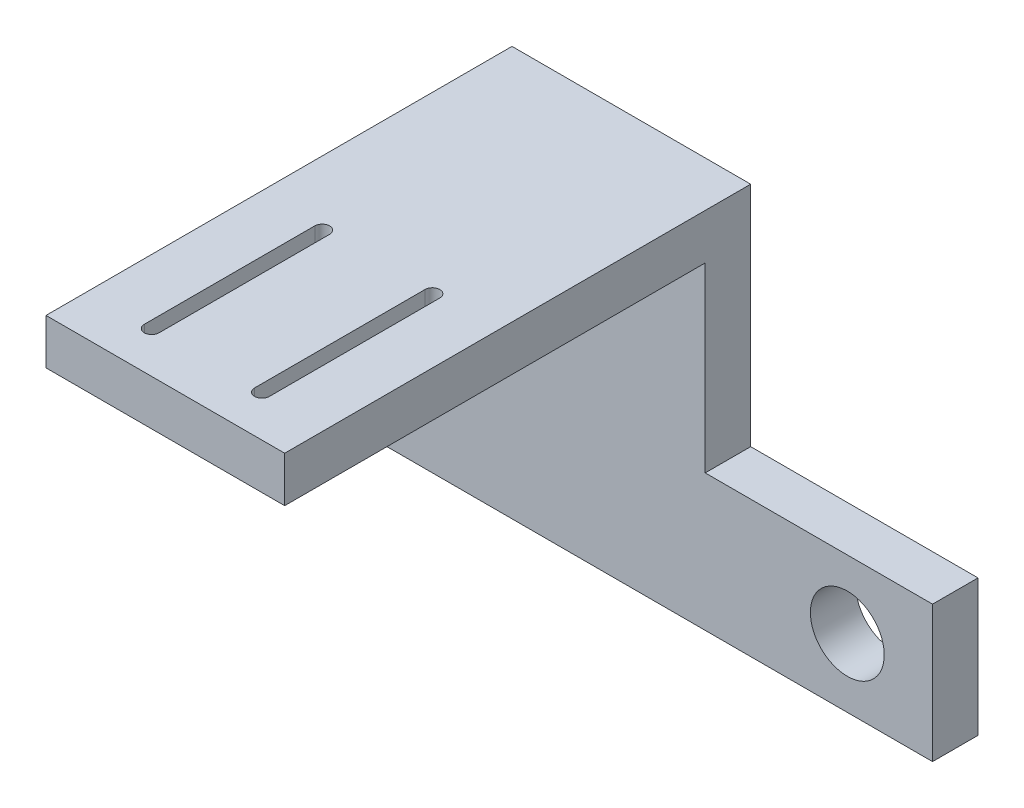
ISO-10303-21;
HEADER;
FILE_DESCRIPTION(('STEP AP214'),'2;1');
FILE_NAME('part.step','',(''),(''),'','','');
FILE_SCHEMA(('AUTOMOTIVE_DESIGN { 1 0 10303 214 1 1 1 1 }'));
ENDSEC;
DATA;
#1=APPLICATION_CONTEXT('core data for automotive mechanical design processes');
#2=APPLICATION_PROTOCOL_DEFINITION('international standard','automotive_design',2000,#1);
#3=PRODUCT_CONTEXT('',#1,'mechanical');
#4=PRODUCT('Part','Part','',(#3));
#5=PRODUCT_RELATED_PRODUCT_CATEGORY('part','',(#4));
#6=PRODUCT_DEFINITION_FORMATION('','',#4);
#7=PRODUCT_DEFINITION_CONTEXT('part definition',#1,'design');
#8=PRODUCT_DEFINITION('design','',#6,#7);
#9=PRODUCT_DEFINITION_SHAPE('','',#8);
#10=(LENGTH_UNIT() NAMED_UNIT(*) SI_UNIT(.MILLI.,.METRE.));
#11=(NAMED_UNIT(*) PLANE_ANGLE_UNIT() SI_UNIT($,.RADIAN.));
#12=(NAMED_UNIT(*) SI_UNIT($,.STERADIAN.) SOLID_ANGLE_UNIT());
#13=UNCERTAINTY_MEASURE_WITH_UNIT(LENGTH_MEASURE(1.E-05),#10,'distance_accuracy_value','');
#14=(GEOMETRIC_REPRESENTATION_CONTEXT(3) GLOBAL_UNCERTAINTY_ASSIGNED_CONTEXT((#13)) GLOBAL_UNIT_ASSIGNED_CONTEXT((#10,
#11,#12)) REPRESENTATION_CONTEXT('',''));
#15=CARTESIAN_POINT('',(0.,0.,0.));
#16=DIRECTION('',(0.,0.,1.));
#17=DIRECTION('',(1.,0.,0.));
#18=AXIS2_PLACEMENT_3D('',#15,#16,#17);
#19=CARTESIAN_POINT('',(0.,12.,4.));
#20=DIRECTION('',(0.,-1.,0.));
#21=DIRECTION('',(1.,0.,0.));
#22=AXIS2_PLACEMENT_3D('',#19,#20,#21);
#23=PLANE('',#22);
#24=DIRECTION('',(0.,0.,1.));
#25=VECTOR('',#24,1.);
#26=CARTESIAN_POINT('',(20.,12.,0.));
#27=LINE('',#26,#25);
#28=CARTESIAN_POINT('',(20.,12.,0.));
#29=VERTEX_POINT('',#28);
#30=CARTESIAN_POINT('',(20.,12.,4.));
#31=VERTEX_POINT('',#30);
#32=EDGE_CURVE('E183',#29,#31,#27,.T.);
#33=ORIENTED_EDGE('',*,*,#32,.F.);
#34=DIRECTION('',(-1.,0.,0.));
#35=VECTOR('',#34,1.);
#36=CARTESIAN_POINT('',(0.,12.,0.));
#37=LINE('',#36,#35);
#38=CARTESIAN_POINT('',(0.,12.,0.));
#39=VERTEX_POINT('',#38);
#40=EDGE_CURVE('E365',#29,#39,#37,.T.);
#41=ORIENTED_EDGE('',*,*,#40,.T.);
#42=DIRECTION('',(0.,0.,-1.));
#43=VECTOR('',#42,1.);
#44=CARTESIAN_POINT('',(0.,12.,4.));
#45=LINE('',#44,#43);
#46=CARTESIAN_POINT('',(0.,12.,4.));
#47=VERTEX_POINT('',#46);
#48=EDGE_CURVE('E355',#47,#39,#45,.T.);
#49=ORIENTED_EDGE('',*,*,#48,.F.);
#50=DIRECTION('',(-1.,0.,0.));
#51=VECTOR('',#50,1.);
#52=CARTESIAN_POINT('',(0.,12.,4.));
#53=LINE('',#52,#51);
#54=EDGE_CURVE('E350',#31,#47,#53,.T.);
#55=ORIENTED_EDGE('',*,*,#54,.F.);
#56=EDGE_LOOP('',(#33,#41,#49,#55));
#57=FACE_BOUND('',#56,.T.);
#58=ADVANCED_FACE('F45',(#57),#23,.F.);
#59=CARTESIAN_POINT('',(0.,0.,4.));
#60=DIRECTION('',(0.,0.,-1.));
#61=DIRECTION('',(-1.,0.,0.));
#62=AXIS2_PLACEMENT_3D('',#59,#60,#61);
#63=PLANE('',#62);
#64=DIRECTION('',(0.,-1.,0.));
#65=VECTOR('',#64,1.);
#66=CARTESIAN_POINT('',(0.,0.,4.));
#67=LINE('',#66,#65);
#68=CARTESIAN_POINT('',(0.,0.,4.));
#69=VERTEX_POINT('',#68);
#70=EDGE_CURVE('E339',#47,#69,#67,.T.);
#71=ORIENTED_EDGE('',*,*,#70,.T.);
#72=DIRECTION('',(1.,0.,0.));
#73=VECTOR('',#72,1.);
#74=CARTESIAN_POINT('',(0.,0.,4.));
#75=LINE('',#74,#73);
#76=CARTESIAN_POINT('',(61.,0.,4.));
#77=VERTEX_POINT('',#76);
#78=EDGE_CURVE('E343',#69,#77,#75,.T.);
#79=ORIENTED_EDGE('',*,*,#78,.T.);
#80=DIRECTION('',(0.,1.,0.));
#81=VECTOR('',#80,1.);
#82=CARTESIAN_POINT('',(61.,0.,4.));
#83=LINE('',#82,#81);
#84=CARTESIAN_POINT('',(61.,12.,4.));
#85=VERTEX_POINT('',#84);
#86=EDGE_CURVE('E347',#77,#85,#83,.T.);
#87=ORIENTED_EDGE('',*,*,#86,.T.);
#88=CARTESIAN_POINT('',(41.,12.,4.));
#89=VERTEX_POINT('',#88);
#90=EDGE_CURVE('E351',#85,#89,#53,.T.);
#91=ORIENTED_EDGE('',*,*,#90,.T.);
#92=DIRECTION('',(0.,1.,0.));
#93=VECTOR('',#92,1.);
#94=CARTESIAN_POINT('',(41.,12.,4.));
#95=LINE('',#94,#93);
#96=CARTESIAN_POINT('',(41.,28.,4.));
#97=VERTEX_POINT('',#96);
#98=EDGE_CURVE('E268',#89,#97,#95,.T.);
#99=ORIENTED_EDGE('',*,*,#98,.T.);
#100=DIRECTION('',(-1.,0.,0.));
#101=VECTOR('',#100,1.);
#102=CARTESIAN_POINT('',(41.,28.,4.));
#103=LINE('',#102,#101);
#104=CARTESIAN_POINT('',(20.,28.,4.));
#105=VERTEX_POINT('',#104);
#106=EDGE_CURVE('E289',#97,#105,#103,.T.);
#107=ORIENTED_EDGE('',*,*,#106,.T.);
#108=DIRECTION('',(0.,1.,0.));
#109=VECTOR('',#108,1.);
#110=CARTESIAN_POINT('',(20.,12.,4.));
#111=LINE('',#110,#109);
#112=EDGE_CURVE('E293',#31,#105,#111,.T.);
#113=ORIENTED_EDGE('',*,*,#112,.F.);
#114=ORIENTED_EDGE('',*,*,#54,.T.);
#115=EDGE_LOOP('',(#71,#79,#87,#91,#99,#107,#113,#114));
#116=FACE_BOUND('',#115,.T.);
#117=CARTESIAN_POINT('',(7.5,6.,4.));
#118=DIRECTION('',(0.,0.,1.));
#119=DIRECTION('',(1.,0.,0.));
#120=AXIS2_PLACEMENT_3D('',#117,#118,#119);
#121=CIRCLE('',#120,3.25);
#122=CARTESIAN_POINT('',(10.75,6.,4.));
#123=VERTEX_POINT('',#122);
#124=EDGE_CURVE('E331',#123,#123,#121,.T.);
#125=ORIENTED_EDGE('',*,*,#124,.F.);
#126=EDGE_LOOP('',(#125));
#127=FACE_BOUND('',#126,.T.);
#128=CARTESIAN_POINT('',(53.5,6.00000000000001,4.));
#129=DIRECTION('',(0.,0.,1.));
#130=DIRECTION('',(1.,0.,0.));
#131=AXIS2_PLACEMENT_3D('',#128,#129,#130);
#132=CIRCLE('',#131,3.25);
#133=CARTESIAN_POINT('',(56.75,6.00000000000001,4.));
#134=VERTEX_POINT('',#133);
#135=EDGE_CURVE('E323',#134,#134,#132,.T.);
#136=ORIENTED_EDGE('',*,*,#135,.F.);
#137=EDGE_LOOP('',(#136));
#138=FACE_BOUND('',#137,.T.);
#139=ADVANCED_FACE('F394',(#116,#127,#138),#63,.F.);
#140=CARTESIAN_POINT('',(0.,0.,0.));
#141=DIRECTION('',(0.,0.,-1.));
#142=DIRECTION('',(-1.,0.,0.));
#143=AXIS2_PLACEMENT_3D('',#140,#141,#142);
#144=PLANE('',#143);
#145=CARTESIAN_POINT('',(7.5,6.,0.));
#146=DIRECTION('',(0.,0.,1.));
#147=DIRECTION('',(1.,0.,0.));
#148=AXIS2_PLACEMENT_3D('',#145,#146,#147);
#149=CIRCLE('',#148,3.25);
#150=CARTESIAN_POINT('',(10.75,6.,0.));
#151=VERTEX_POINT('',#150);
#152=EDGE_CURVE('E327',#151,#151,#149,.T.);
#153=ORIENTED_EDGE('',*,*,#152,.T.);
#154=EDGE_LOOP('',(#153));
#155=FACE_BOUND('',#154,.T.);
#156=DIRECTION('',(0.,-1.,0.));
#157=VECTOR('',#156,1.);
#158=CARTESIAN_POINT('',(0.,0.,0.));
#159=LINE('',#158,#157);
#160=CARTESIAN_POINT('',(0.,0.,0.));
#161=VERTEX_POINT('',#160);
#162=EDGE_CURVE('E335',#39,#161,#159,.T.);
#163=ORIENTED_EDGE('',*,*,#162,.F.);
#164=ORIENTED_EDGE('',*,*,#40,.F.);
#165=DIRECTION('',(0.,-1.,0.));
#166=VECTOR('',#165,1.);
#167=CARTESIAN_POINT('',(20.,32.,0.));
#168=LINE('',#167,#166);
#169=CARTESIAN_POINT('',(20.,32.,0.));
#170=VERTEX_POINT('',#169);
#171=EDGE_CURVE('E269',#170,#29,#168,.T.);
#172=ORIENTED_EDGE('',*,*,#171,.F.);
#173=DIRECTION('',(-1.,0.,0.));
#174=VECTOR('',#173,1.);
#175=CARTESIAN_POINT('',(41.,32.,0.));
#176=LINE('',#175,#174);
#177=CARTESIAN_POINT('',(41.,32.,0.));
#178=VERTEX_POINT('',#177);
#179=EDGE_CURVE('E311',#178,#170,#176,.T.);
#180=ORIENTED_EDGE('',*,*,#179,.F.);
#181=DIRECTION('',(0.,-1.,0.));
#182=VECTOR('',#181,1.);
#183=CARTESIAN_POINT('',(41.,32.,0.));
#184=LINE('',#183,#182);
#185=CARTESIAN_POINT('',(41.,12.,0.));
#186=VERTEX_POINT('',#185);
#187=EDGE_CURVE('E285',#178,#186,#184,.T.);
#188=ORIENTED_EDGE('',*,*,#187,.T.);
#189=CARTESIAN_POINT('',(61.,12.,0.));
#190=VERTEX_POINT('',#189);
#191=EDGE_CURVE('E344',#190,#186,#37,.T.);
#192=ORIENTED_EDGE('',*,*,#191,.F.);
#193=DIRECTION('',(0.,1.,0.));
#194=VECTOR('',#193,1.);
#195=CARTESIAN_POINT('',(61.,0.,0.));
#196=LINE('',#195,#194);
#197=CARTESIAN_POINT('',(61.,0.,0.));
#198=VERTEX_POINT('',#197);
#199=EDGE_CURVE('E362',#198,#190,#196,.T.);
#200=ORIENTED_EDGE('',*,*,#199,.F.);
#201=DIRECTION('',(1.,0.,0.));
#202=VECTOR('',#201,1.);
#203=CARTESIAN_POINT('',(0.,0.,0.));
#204=LINE('',#203,#202);
#205=EDGE_CURVE('E359',#161,#198,#204,.T.);
#206=ORIENTED_EDGE('',*,*,#205,.F.);
#207=EDGE_LOOP('',(#163,#164,#172,#180,#188,#192,#200,#206));
#208=FACE_BOUND('',#207,.T.);
#209=CARTESIAN_POINT('',(53.5,6.00000000000001,0.));
#210=DIRECTION('',(0.,0.,1.));
#211=DIRECTION('',(1.,0.,0.));
#212=AXIS2_PLACEMENT_3D('',#209,#210,#211);
#213=CIRCLE('',#212,3.25);
#214=CARTESIAN_POINT('',(56.75,6.00000000000001,0.));
#215=VERTEX_POINT('',#214);
#216=EDGE_CURVE('E314',#215,#215,#213,.T.);
#217=ORIENTED_EDGE('',*,*,#216,.T.);
#218=EDGE_LOOP('',(#217));
#219=FACE_BOUND('',#218,.T.);
#220=ADVANCED_FACE('F387',(#155,#208,#219),#144,.T.);
#221=CARTESIAN_POINT('',(0.,0.,4.));
#222=DIRECTION('',(1.,0.,0.));
#223=DIRECTION('',(0.,0.,-1.));
#224=AXIS2_PLACEMENT_3D('',#221,#222,#223);
#225=PLANE('',#224);
#226=ORIENTED_EDGE('',*,*,#162,.T.);
#227=DIRECTION('',(0.,0.,-1.));
#228=VECTOR('',#227,1.);
#229=CARTESIAN_POINT('',(0.,0.,4.));
#230=LINE('',#229,#228);
#231=EDGE_CURVE('E11',#69,#161,#230,.T.);
#232=ORIENTED_EDGE('',*,*,#231,.F.);
#233=ORIENTED_EDGE('',*,*,#70,.F.);
#234=ORIENTED_EDGE('',*,*,#48,.T.);
#235=EDGE_LOOP('',(#226,#232,#233,#234));
#236=FACE_BOUND('',#235,.T.);
#237=ADVANCED_FACE('F47',(#236),#225,.F.);
#238=CARTESIAN_POINT('',(0.,0.,4.));
#239=DIRECTION('',(0.,1.,0.));
#240=DIRECTION('',(-1.,0.,0.));
#241=AXIS2_PLACEMENT_3D('',#238,#239,#240);
#242=PLANE('',#241);
#243=ORIENTED_EDGE('',*,*,#205,.T.);
#244=DIRECTION('',(0.,0.,-1.));
#245=VECTOR('',#244,1.);
#246=CARTESIAN_POINT('',(61.,0.,4.));
#247=LINE('',#246,#245);
#248=EDGE_CURVE('E54',#77,#198,#247,.T.);
#249=ORIENTED_EDGE('',*,*,#248,.F.);
#250=ORIENTED_EDGE('',*,*,#78,.F.);
#251=ORIENTED_EDGE('',*,*,#231,.T.);
#252=EDGE_LOOP('',(#243,#249,#250,#251));
#253=FACE_BOUND('',#252,.T.);
#254=ADVANCED_FACE('F398',(#253),#242,.F.);
#255=CARTESIAN_POINT('',(61.,0.,4.));
#256=DIRECTION('',(-1.,0.,0.));
#257=DIRECTION('',(0.,0.,1.));
#258=AXIS2_PLACEMENT_3D('',#255,#256,#257);
#259=PLANE('',#258);
#260=ORIENTED_EDGE('',*,*,#199,.T.);
#261=DIRECTION('',(0.,0.,-1.));
#262=VECTOR('',#261,1.);
#263=CARTESIAN_POINT('',(61.,12.,4.));
#264=LINE('',#263,#262);
#265=EDGE_CURVE('E372',#85,#190,#264,.T.);
#266=ORIENTED_EDGE('',*,*,#265,.F.);
#267=ORIENTED_EDGE('',*,*,#86,.F.);
#268=ORIENTED_EDGE('',*,*,#248,.T.);
#269=EDGE_LOOP('',(#260,#266,#267,#268));
#270=FACE_BOUND('',#269,.T.);
#271=ADVANCED_FACE('F381',(#270),#259,.F.);
#272=ORIENTED_EDGE('',*,*,#191,.T.);
#273=DIRECTION('',(0.,0.,1.));
#274=VECTOR('',#273,1.);
#275=CARTESIAN_POINT('',(41.,12.,0.));
#276=LINE('',#275,#274);
#277=EDGE_CURVE('E264',#186,#89,#276,.T.);
#278=ORIENTED_EDGE('',*,*,#277,.T.);
#279=ORIENTED_EDGE('',*,*,#90,.F.);
#280=ORIENTED_EDGE('',*,*,#265,.T.);
#281=EDGE_LOOP('',(#272,#278,#279,#280));
#282=FACE_BOUND('',#281,.T.);
#283=ADVANCED_FACE('F391',(#282),#23,.F.);
#284=CARTESIAN_POINT('',(7.5,6.,4.));
#285=DIRECTION('',(0.,0.,-1.));
#286=DIRECTION('',(-1.,0.,0.));
#287=AXIS2_PLACEMENT_3D('',#284,#285,#286);
#288=CYLINDRICAL_SURFACE('',#287,3.25);
#289=ORIENTED_EDGE('',*,*,#124,.T.);
#290=EDGE_LOOP('',(#289));
#291=FACE_BOUND('',#290,.T.);
#292=ORIENTED_EDGE('',*,*,#152,.F.);
#293=EDGE_LOOP('',(#292));
#294=FACE_BOUND('',#293,.T.);
#295=ADVANCED_FACE('F418',(#291,#294),#288,.F.);
#296=CARTESIAN_POINT('',(53.5,6.00000000000001,4.));
#297=DIRECTION('',(0.,0.,-1.));
#298=DIRECTION('',(-1.,0.,0.));
#299=AXIS2_PLACEMENT_3D('',#296,#297,#298);
#300=CYLINDRICAL_SURFACE('',#299,3.25);
#301=ORIENTED_EDGE('',*,*,#135,.T.);
#302=EDGE_LOOP('',(#301));
#303=FACE_BOUND('',#302,.T.);
#304=ORIENTED_EDGE('',*,*,#216,.F.);
#305=EDGE_LOOP('',(#304));
#306=FACE_BOUND('',#305,.T.);
#307=ADVANCED_FACE('F424',(#303,#306),#300,.F.);
#308=CARTESIAN_POINT('',(41.,32.,41.));
#309=DIRECTION('',(0.,1.,0.));
#310=DIRECTION('',(0.,0.,1.));
#311=AXIS2_PLACEMENT_3D('',#308,#309,#310);
#312=PLANE('',#311);
#313=CARTESIAN_POINT('',(35.35,32.,22.35));
#314=DIRECTION('',(0.,1.,0.));
#315=DIRECTION('',(0.,0.,1.));
#316=AXIS2_PLACEMENT_3D('',#313,#314,#315);
#317=CIRCLE('',#316,0.649999999999991);
#318=CARTESIAN_POINT('',(36.,32.,22.35));
#319=VERTEX_POINT('',#318);
#320=CARTESIAN_POINT('',(34.7,32.,22.35));
#321=VERTEX_POINT('',#320);
#322=EDGE_CURVE('E61',#319,#321,#317,.T.);
#323=ORIENTED_EDGE('',*,*,#322,.F.);
#324=DIRECTION('',(0.,0.,-1.));
#325=VECTOR('',#324,1.);
#326=CARTESIAN_POINT('',(36.,32.,22.35));
#327=LINE('',#326,#325);
#328=CARTESIAN_POINT('',(36.,32.,37.35));
#329=VERTEX_POINT('',#328);
#330=EDGE_CURVE('E190',#329,#319,#327,.T.);
#331=ORIENTED_EDGE('',*,*,#330,.F.);
#332=CARTESIAN_POINT('',(35.35,32.,37.35));
#333=DIRECTION('',(0.,1.,0.));
#334=DIRECTION('',(0.,0.,1.));
#335=AXIS2_PLACEMENT_3D('',#332,#333,#334);
#336=CIRCLE('',#335,0.649999999999991);
#337=CARTESIAN_POINT('',(34.7,32.,37.35));
#338=VERTEX_POINT('',#337);
#339=EDGE_CURVE('E208',#338,#329,#336,.T.);
#340=ORIENTED_EDGE('',*,*,#339,.F.);
#341=DIRECTION('',(0.,0.,1.));
#342=VECTOR('',#341,1.);
#343=CARTESIAN_POINT('',(34.7,32.,22.35));
#344=LINE('',#343,#342);
#345=EDGE_CURVE('E200',#321,#338,#344,.T.);
#346=ORIENTED_EDGE('',*,*,#345,.F.);
#347=EDGE_LOOP('',(#323,#331,#340,#346));
#348=FACE_BOUND('',#347,.T.);
#349=CARTESIAN_POINT('',(25.65,32.,22.35));
#350=DIRECTION('',(0.,1.,0.));
#351=DIRECTION('',(0.,0.,1.));
#352=AXIS2_PLACEMENT_3D('',#349,#350,#351);
#353=CIRCLE('',#352,0.650000000000005);
#354=CARTESIAN_POINT('',(26.3,32.,22.35));
#355=VERTEX_POINT('',#354);
#356=CARTESIAN_POINT('',(25.,32.,22.35));
#357=VERTEX_POINT('',#356);
#358=EDGE_CURVE('E69',#355,#357,#353,.T.);
#359=ORIENTED_EDGE('',*,*,#358,.F.);
#360=DIRECTION('',(0.,0.,-1.));
#361=VECTOR('',#360,1.);
#362=CARTESIAN_POINT('',(26.3,32.,22.35));
#363=LINE('',#362,#361);
#364=CARTESIAN_POINT('',(26.3,32.,37.35));
#365=VERTEX_POINT('',#364);
#366=EDGE_CURVE('E230',#365,#355,#363,.T.);
#367=ORIENTED_EDGE('',*,*,#366,.F.);
#368=CARTESIAN_POINT('',(25.65,32.,37.35));
#369=DIRECTION('',(0.,1.,0.));
#370=DIRECTION('',(0.,0.,1.));
#371=AXIS2_PLACEMENT_3D('',#368,#369,#370);
#372=CIRCLE('',#371,0.650000000000005);
#373=CARTESIAN_POINT('',(25.,32.,37.35));
#374=VERTEX_POINT('',#373);
#375=EDGE_CURVE('E242',#374,#365,#372,.T.);
#376=ORIENTED_EDGE('',*,*,#375,.F.);
#377=DIRECTION('',(0.,0.,1.));
#378=VECTOR('',#377,1.);
#379=CARTESIAN_POINT('',(25.,32.,22.35));
#380=LINE('',#379,#378);
#381=EDGE_CURVE('E246',#357,#374,#380,.T.);
#382=ORIENTED_EDGE('',*,*,#381,.F.);
#383=EDGE_LOOP('',(#359,#367,#376,#382));
#384=FACE_BOUND('',#383,.T.);
#385=DIRECTION('',(0.,0.,-1.));
#386=VECTOR('',#385,1.);
#387=CARTESIAN_POINT('',(20.,32.,41.));
#388=LINE('',#387,#386);
#389=CARTESIAN_POINT('',(20.,32.,41.));
#390=VERTEX_POINT('',#389);
#391=EDGE_CURVE('E305',#390,#170,#388,.T.);
#392=ORIENTED_EDGE('',*,*,#391,.F.);
#393=DIRECTION('',(-1.,0.,0.));
#394=VECTOR('',#393,1.);
#395=CARTESIAN_POINT('',(41.,32.,41.));
#396=LINE('',#395,#394);
#397=CARTESIAN_POINT('',(41.,32.,41.));
#398=VERTEX_POINT('',#397);
#399=EDGE_CURVE('E315',#398,#390,#396,.T.);
#400=ORIENTED_EDGE('',*,*,#399,.F.);
#401=DIRECTION('',(0.,0.,-1.));
#402=VECTOR('',#401,1.);
#403=CARTESIAN_POINT('',(41.,32.,41.));
#404=LINE('',#403,#402);
#405=EDGE_CURVE('E281',#398,#178,#404,.T.);
#406=ORIENTED_EDGE('',*,*,#405,.T.);
#407=ORIENTED_EDGE('',*,*,#179,.T.);
#408=EDGE_LOOP('',(#392,#400,#406,#407));
#409=FACE_BOUND('',#408,.T.);
#410=ADVANCED_FACE('F441',(#348,#384,#409),#312,.T.);
#411=CARTESIAN_POINT('',(41.,28.,41.));
#412=DIRECTION('',(0.,0.,1.));
#413=DIRECTION('',(0.,-1.,0.));
#414=AXIS2_PLACEMENT_3D('',#411,#412,#413);
#415=PLANE('',#414);
#416=DIRECTION('',(0.,1.,0.));
#417=VECTOR('',#416,1.);
#418=CARTESIAN_POINT('',(20.,28.,41.));
#419=LINE('',#418,#417);
#420=CARTESIAN_POINT('',(20.,28.,41.));
#421=VERTEX_POINT('',#420);
#422=EDGE_CURVE('E301',#421,#390,#419,.T.);
#423=ORIENTED_EDGE('',*,*,#422,.F.);
#424=DIRECTION('',(-1.,0.,0.));
#425=VECTOR('',#424,1.);
#426=CARTESIAN_POINT('',(41.,28.,41.));
#427=LINE('',#426,#425);
#428=CARTESIAN_POINT('',(41.,28.,41.));
#429=VERTEX_POINT('',#428);
#430=EDGE_CURVE('E318',#429,#421,#427,.T.);
#431=ORIENTED_EDGE('',*,*,#430,.F.);
#432=DIRECTION('',(0.,1.,0.));
#433=VECTOR('',#432,1.);
#434=CARTESIAN_POINT('',(41.,28.,41.));
#435=LINE('',#434,#433);
#436=EDGE_CURVE('E277',#429,#398,#435,.T.);
#437=ORIENTED_EDGE('',*,*,#436,.T.);
#438=ORIENTED_EDGE('',*,*,#399,.T.);
#439=EDGE_LOOP('',(#423,#431,#437,#438));
#440=FACE_BOUND('',#439,.T.);
#441=ADVANCED_FACE('F446',(#440),#415,.T.);
#442=CARTESIAN_POINT('',(41.,28.,4.));
#443=DIRECTION('',(0.,-1.,0.));
#444=DIRECTION('',(0.,0.,-1.));
#445=AXIS2_PLACEMENT_3D('',#442,#443,#444);
#446=PLANE('',#445);
#447=CARTESIAN_POINT('',(35.35,28.,22.35));
#448=DIRECTION('',(0.,-1.,0.));
#449=DIRECTION('',(0.,0.,-1.));
#450=AXIS2_PLACEMENT_3D('',#447,#448,#449);
#451=CIRCLE('',#450,0.649999999999991);
#452=CARTESIAN_POINT('',(36.,28.,22.35));
#453=VERTEX_POINT('',#452);
#454=CARTESIAN_POINT('',(34.7,28.,22.35));
#455=VERTEX_POINT('',#454);
#456=EDGE_CURVE('E187',#453,#455,#451,.F.);
#457=ORIENTED_EDGE('',*,*,#456,.T.);
#458=DIRECTION('',(0.,0.,1.));
#459=VECTOR('',#458,1.);
#460=CARTESIAN_POINT('',(34.7,28.,22.35));
#461=LINE('',#460,#459);
#462=CARTESIAN_POINT('',(34.7,28.,37.35));
#463=VERTEX_POINT('',#462);
#464=EDGE_CURVE('E172',#455,#463,#461,.T.);
#465=ORIENTED_EDGE('',*,*,#464,.T.);
#466=CARTESIAN_POINT('',(35.35,28.,37.35));
#467=DIRECTION('',(0.,-1.,0.));
#468=DIRECTION('',(0.,0.,-1.));
#469=AXIS2_PLACEMENT_3D('',#466,#467,#468);
#470=CIRCLE('',#469,0.649999999999991);
#471=CARTESIAN_POINT('',(36.,28.,37.35));
#472=VERTEX_POINT('',#471);
#473=EDGE_CURVE('E202',#463,#472,#470,.F.);
#474=ORIENTED_EDGE('',*,*,#473,.T.);
#475=DIRECTION('',(0.,0.,-1.));
#476=VECTOR('',#475,1.);
#477=CARTESIAN_POINT('',(36.,28.,22.35));
#478=LINE('',#477,#476);
#479=EDGE_CURVE('E195',#472,#453,#478,.T.);
#480=ORIENTED_EDGE('',*,*,#479,.T.);
#481=EDGE_LOOP('',(#457,#465,#474,#480));
#482=FACE_BOUND('',#481,.T.);
#483=CARTESIAN_POINT('',(25.65,28.,22.35));
#484=DIRECTION('',(0.,-1.,0.));
#485=DIRECTION('',(0.,0.,-1.));
#486=AXIS2_PLACEMENT_3D('',#483,#484,#485);
#487=CIRCLE('',#486,0.650000000000005);
#488=CARTESIAN_POINT('',(26.3,28.,22.35));
#489=VERTEX_POINT('',#488);
#490=CARTESIAN_POINT('',(25.,28.,22.35));
#491=VERTEX_POINT('',#490);
#492=EDGE_CURVE('E252',#489,#491,#487,.F.);
#493=ORIENTED_EDGE('',*,*,#492,.T.);
#494=DIRECTION('',(0.,0.,1.));
#495=VECTOR('',#494,1.);
#496=CARTESIAN_POINT('',(25.,28.,22.35));
#497=LINE('',#496,#495);
#498=CARTESIAN_POINT('',(25.,28.,37.35));
#499=VERTEX_POINT('',#498);
#500=EDGE_CURVE('E222',#491,#499,#497,.T.);
#501=ORIENTED_EDGE('',*,*,#500,.T.);
#502=CARTESIAN_POINT('',(25.65,28.,37.35));
#503=DIRECTION('',(0.,-1.,0.));
#504=DIRECTION('',(0.,0.,-1.));
#505=AXIS2_PLACEMENT_3D('',#502,#503,#504);
#506=CIRCLE('',#505,0.650000000000005);
#507=CARTESIAN_POINT('',(26.3,28.,37.35));
#508=VERTEX_POINT('',#507);
#509=EDGE_CURVE('E260',#499,#508,#506,.F.);
#510=ORIENTED_EDGE('',*,*,#509,.T.);
#511=DIRECTION('',(0.,0.,-1.));
#512=VECTOR('',#511,1.);
#513=CARTESIAN_POINT('',(26.3,28.,22.35));
#514=LINE('',#513,#512);
#515=EDGE_CURVE('E256',#508,#489,#514,.T.);
#516=ORIENTED_EDGE('',*,*,#515,.T.);
#517=EDGE_LOOP('',(#493,#501,#510,#516));
#518=FACE_BOUND('',#517,.T.);
#519=DIRECTION('',(0.,0.,1.));
#520=VECTOR('',#519,1.);
#521=CARTESIAN_POINT('',(20.,28.,4.));
#522=LINE('',#521,#520);
#523=EDGE_CURVE('E297',#105,#421,#522,.T.);
#524=ORIENTED_EDGE('',*,*,#523,.F.);
#525=ORIENTED_EDGE('',*,*,#106,.F.);
#526=DIRECTION('',(0.,0.,1.));
#527=VECTOR('',#526,1.);
#528=CARTESIAN_POINT('',(41.,28.,4.));
#529=LINE('',#528,#527);
#530=EDGE_CURVE('E273',#97,#429,#529,.T.);
#531=ORIENTED_EDGE('',*,*,#530,.T.);
#532=ORIENTED_EDGE('',*,*,#430,.T.);
#533=EDGE_LOOP('',(#524,#525,#531,#532));
#534=FACE_BOUND('',#533,.T.);
#535=ADVANCED_FACE('F193',(#482,#518,#534),#446,.T.);
#536=CARTESIAN_POINT('',(41.,0.,0.));
#537=DIRECTION('',(-1.,0.,0.));
#538=DIRECTION('',(0.,0.,1.));
#539=AXIS2_PLACEMENT_3D('',#536,#537,#538);
#540=PLANE('',#539);
#541=ORIENTED_EDGE('',*,*,#277,.F.);
#542=ORIENTED_EDGE('',*,*,#187,.F.);
#543=ORIENTED_EDGE('',*,*,#405,.F.);
#544=ORIENTED_EDGE('',*,*,#436,.F.);
#545=ORIENTED_EDGE('',*,*,#530,.F.);
#546=ORIENTED_EDGE('',*,*,#98,.F.);
#547=EDGE_LOOP('',(#541,#542,#543,#544,#545,#546));
#548=FACE_BOUND('',#547,.T.);
#549=ADVANCED_FACE('F445',(#548),#540,.F.);
#550=CARTESIAN_POINT('',(20.,0.,0.));
#551=DIRECTION('',(-1.,0.,0.));
#552=DIRECTION('',(0.,0.,1.));
#553=AXIS2_PLACEMENT_3D('',#550,#551,#552);
#554=PLANE('',#553);
#555=ORIENTED_EDGE('',*,*,#32,.T.);
#556=ORIENTED_EDGE('',*,*,#112,.T.);
#557=ORIENTED_EDGE('',*,*,#523,.T.);
#558=ORIENTED_EDGE('',*,*,#422,.T.);
#559=ORIENTED_EDGE('',*,*,#391,.T.);
#560=ORIENTED_EDGE('',*,*,#171,.T.);
#561=EDGE_LOOP('',(#555,#556,#557,#558,#559,#560));
#562=FACE_BOUND('',#561,.T.);
#563=ADVANCED_FACE('F452',(#562),#554,.T.);
#564=CARTESIAN_POINT('',(25.65,-0.001000000000001,22.35));
#565=DIRECTION('',(0.,1.,0.));
#566=DIRECTION('',(0.,0.,1.));
#567=AXIS2_PLACEMENT_3D('',#564,#565,#566);
#568=CYLINDRICAL_SURFACE('',#567,0.650000000000005);
#569=DIRECTION('',(0.,1.,0.));
#570=VECTOR('',#569,1.);
#571=CARTESIAN_POINT('',(26.3,-0.001000000000001,22.35));
#572=LINE('',#571,#570);
#573=EDGE_CURVE('E226',#489,#355,#572,.T.);
#574=ORIENTED_EDGE('',*,*,#573,.T.);
#575=ORIENTED_EDGE('',*,*,#358,.T.);
#576=DIRECTION('',(0.,1.,0.));
#577=VECTOR('',#576,1.);
#578=CARTESIAN_POINT('',(25.,-0.001000000000001,22.35));
#579=LINE('',#578,#577);
#580=EDGE_CURVE('E227',#491,#357,#579,.T.);
#581=ORIENTED_EDGE('',*,*,#580,.F.);
#582=ORIENTED_EDGE('',*,*,#492,.F.);
#583=EDGE_LOOP('',(#574,#575,#581,#582));
#584=FACE_BOUND('',#583,.T.);
#585=ADVANCED_FACE('F455',(#584),#568,.F.);
#586=CARTESIAN_POINT('',(26.3,-0.001000000000001,22.35));
#587=DIRECTION('',(1.,0.,0.));
#588=DIRECTION('',(0.,0.,-1.));
#589=AXIS2_PLACEMENT_3D('',#586,#587,#588);
#590=PLANE('',#589);
#591=DIRECTION('',(0.,1.,0.));
#592=VECTOR('',#591,1.);
#593=CARTESIAN_POINT('',(26.3,-0.001000000000001,37.35));
#594=LINE('',#593,#592);
#595=EDGE_CURVE('E234',#508,#365,#594,.T.);
#596=ORIENTED_EDGE('',*,*,#595,.T.);
#597=ORIENTED_EDGE('',*,*,#366,.T.);
#598=ORIENTED_EDGE('',*,*,#573,.F.);
#599=ORIENTED_EDGE('',*,*,#515,.F.);
#600=EDGE_LOOP('',(#596,#597,#598,#599));
#601=FACE_BOUND('',#600,.T.);
#602=ADVANCED_FACE('F460',(#601),#590,.F.);
#603=CARTESIAN_POINT('',(25.65,-0.001000000000001,37.35));
#604=DIRECTION('',(0.,1.,0.));
#605=DIRECTION('',(0.,0.,1.));
#606=AXIS2_PLACEMENT_3D('',#603,#604,#605);
#607=CYLINDRICAL_SURFACE('',#606,0.650000000000005);
#608=DIRECTION('',(0.,1.,0.));
#609=VECTOR('',#608,1.);
#610=CARTESIAN_POINT('',(25.,-0.001000000000001,37.35));
#611=LINE('',#610,#609);
#612=EDGE_CURVE('E231',#499,#374,#611,.T.);
#613=ORIENTED_EDGE('',*,*,#612,.T.);
#614=ORIENTED_EDGE('',*,*,#375,.T.);
#615=ORIENTED_EDGE('',*,*,#595,.F.);
#616=ORIENTED_EDGE('',*,*,#509,.F.);
#617=EDGE_LOOP('',(#613,#614,#615,#616));
#618=FACE_BOUND('',#617,.T.);
#619=ADVANCED_FACE('F463',(#618),#607,.F.);
#620=CARTESIAN_POINT('',(25.,-0.001000000000001,22.35));
#621=DIRECTION('',(-1.,0.,0.));
#622=DIRECTION('',(0.,0.,1.));
#623=AXIS2_PLACEMENT_3D('',#620,#621,#622);
#624=PLANE('',#623);
#625=ORIENTED_EDGE('',*,*,#580,.T.);
#626=ORIENTED_EDGE('',*,*,#381,.T.);
#627=ORIENTED_EDGE('',*,*,#612,.F.);
#628=ORIENTED_EDGE('',*,*,#500,.F.);
#629=EDGE_LOOP('',(#625,#626,#627,#628));
#630=FACE_BOUND('',#629,.T.);
#631=ADVANCED_FACE('F467',(#630),#624,.F.);
#632=CARTESIAN_POINT('',(35.35,-0.001000000000001,22.35));
#633=DIRECTION('',(0.,1.,0.));
#634=DIRECTION('',(0.,0.,1.));
#635=AXIS2_PLACEMENT_3D('',#632,#633,#634);
#636=CYLINDRICAL_SURFACE('',#635,0.649999999999991);
#637=DIRECTION('',(0.,1.,0.));
#638=VECTOR('',#637,1.);
#639=CARTESIAN_POINT('',(36.,-0.001000000000001,22.35));
#640=LINE('',#639,#638);
#641=EDGE_CURVE('E184',#453,#319,#640,.T.);
#642=ORIENTED_EDGE('',*,*,#641,.T.);
#643=ORIENTED_EDGE('',*,*,#322,.T.);
#644=DIRECTION('',(0.,1.,0.));
#645=VECTOR('',#644,1.);
#646=CARTESIAN_POINT('',(34.7,-0.001000000000001,22.35));
#647=LINE('',#646,#645);
#648=EDGE_CURVE('E175',#455,#321,#647,.T.);
#649=ORIENTED_EDGE('',*,*,#648,.F.);
#650=ORIENTED_EDGE('',*,*,#456,.F.);
#651=EDGE_LOOP('',(#642,#643,#649,#650));
#652=FACE_BOUND('',#651,.T.);
#653=ADVANCED_FACE('F186',(#652),#636,.F.);
#654=CARTESIAN_POINT('',(36.,-0.001000000000001,22.35));
#655=DIRECTION('',(1.,0.,0.));
#656=DIRECTION('',(0.,0.,-1.));
#657=AXIS2_PLACEMENT_3D('',#654,#655,#656);
#658=PLANE('',#657);
#659=DIRECTION('',(0.,1.,0.));
#660=VECTOR('',#659,1.);
#661=CARTESIAN_POINT('',(36.,-0.001000000000001,37.35));
#662=LINE('',#661,#660);
#663=EDGE_CURVE('E217',#472,#329,#662,.T.);
#664=ORIENTED_EDGE('',*,*,#663,.T.);
#665=ORIENTED_EDGE('',*,*,#330,.T.);
#666=ORIENTED_EDGE('',*,*,#641,.F.);
#667=ORIENTED_EDGE('',*,*,#479,.F.);
#668=EDGE_LOOP('',(#664,#665,#666,#667));
#669=FACE_BOUND('',#668,.T.);
#670=ADVANCED_FACE('F476',(#669),#658,.F.);
#671=CARTESIAN_POINT('',(35.35,-0.001000000000001,37.35));
#672=DIRECTION('',(0.,1.,0.));
#673=DIRECTION('',(0.,0.,1.));
#674=AXIS2_PLACEMENT_3D('',#671,#672,#673);
#675=CYLINDRICAL_SURFACE('',#674,0.649999999999991);
#676=DIRECTION('',(0.,1.,0.));
#677=VECTOR('',#676,1.);
#678=CARTESIAN_POINT('',(34.7,-0.001000000000001,37.35));
#679=LINE('',#678,#677);
#680=EDGE_CURVE('E177',#463,#338,#679,.T.);
#681=ORIENTED_EDGE('',*,*,#680,.T.);
#682=ORIENTED_EDGE('',*,*,#339,.T.);
#683=ORIENTED_EDGE('',*,*,#663,.F.);
#684=ORIENTED_EDGE('',*,*,#473,.F.);
#685=EDGE_LOOP('',(#681,#682,#683,#684));
#686=FACE_BOUND('',#685,.T.);
#687=ADVANCED_FACE('F479',(#686),#675,.F.);
#688=CARTESIAN_POINT('',(34.7,-0.001000000000001,22.35));
#689=DIRECTION('',(-1.,0.,0.));
#690=DIRECTION('',(0.,0.,1.));
#691=AXIS2_PLACEMENT_3D('',#688,#689,#690);
#692=PLANE('',#691);
#693=ORIENTED_EDGE('',*,*,#648,.T.);
#694=ORIENTED_EDGE('',*,*,#345,.T.);
#695=ORIENTED_EDGE('',*,*,#680,.F.);
#696=ORIENTED_EDGE('',*,*,#464,.F.);
#697=EDGE_LOOP('',(#693,#694,#695,#696));
#698=FACE_BOUND('',#697,.T.);
#699=ADVANCED_FACE('F173',(#698),#692,.F.);
#700=CLOSED_SHELL('',(#58,#139,#220,#237,#254,#271,#283,#295,#307,#410,#441,#535,#549,#563,#585,
#602,#619,#631,#653,#670,#687,#699));
#701=MANIFOLD_SOLID_BREP('B2',#700);
#702=ADVANCED_BREP_SHAPE_REPRESENTATION('',(#18,#701),#14);
#703=SHAPE_DEFINITION_REPRESENTATION(#9,#702);
ENDSEC;
END-ISO-10303-21;
